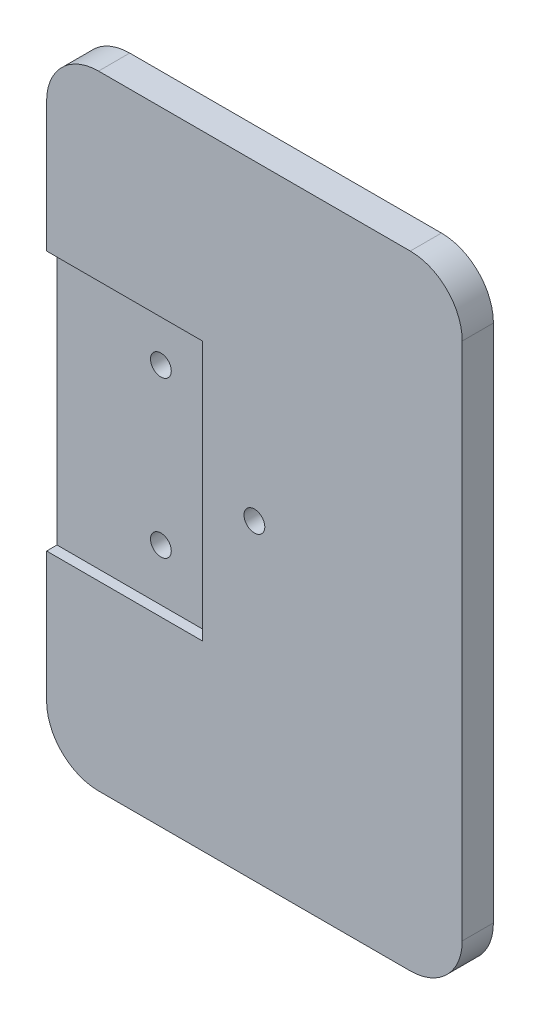
ISO-10303-21;
HEADER;
FILE_DESCRIPTION(('STEP AP214'),'2;1');
FILE_NAME('part.step','',(''),(''),'','','');
FILE_SCHEMA(('AUTOMOTIVE_DESIGN { 1 0 10303 214 1 1 1 1 }'));
ENDSEC;
DATA;
#1=APPLICATION_CONTEXT('core data for automotive mechanical design processes');
#2=APPLICATION_PROTOCOL_DEFINITION('international standard','automotive_design',2000,#1);
#3=PRODUCT_CONTEXT('',#1,'mechanical');
#4=PRODUCT('Part','Part','',(#3));
#5=PRODUCT_RELATED_PRODUCT_CATEGORY('part','',(#4));
#6=PRODUCT_DEFINITION_FORMATION('','',#4);
#7=PRODUCT_DEFINITION_CONTEXT('part definition',#1,'design');
#8=PRODUCT_DEFINITION('design','',#6,#7);
#9=PRODUCT_DEFINITION_SHAPE('','',#8);
#10=(LENGTH_UNIT() NAMED_UNIT(*) SI_UNIT(.MILLI.,.METRE.));
#11=(NAMED_UNIT(*) PLANE_ANGLE_UNIT() SI_UNIT($,.RADIAN.));
#12=(NAMED_UNIT(*) SI_UNIT($,.STERADIAN.) SOLID_ANGLE_UNIT());
#13=UNCERTAINTY_MEASURE_WITH_UNIT(LENGTH_MEASURE(1.E-05),#10,'distance_accuracy_value','');
#14=(GEOMETRIC_REPRESENTATION_CONTEXT(3) GLOBAL_UNCERTAINTY_ASSIGNED_CONTEXT((#13)) GLOBAL_UNIT_ASSIGNED_CONTEXT((#10,
#11,#12)) REPRESENTATION_CONTEXT('',''));
#15=CARTESIAN_POINT('',(0.,0.,0.));
#16=DIRECTION('',(0.,0.,1.));
#17=DIRECTION('',(1.,0.,0.));
#18=AXIS2_PLACEMENT_3D('',#15,#16,#17);
#19=CARTESIAN_POINT('',(-65.9850692997892,26.8064344030394,-3.));
#20=DIRECTION('',(0.,-1.,0.));
#21=DIRECTION('',(0.,0.,-1.));
#22=AXIS2_PLACEMENT_3D('',#19,#20,#21);
#23=PLANE('',#22);
#24=DIRECTION('',(1.,0.,0.));
#25=VECTOR('',#24,1.);
#26=CARTESIAN_POINT('',(-65.9850692997892,26.8064344030394,0.));
#27=LINE('',#26,#25);
#28=CARTESIAN_POINT('',(-60.9850692997892,26.8064344030394,0.));
#29=VERTEX_POINT('',#28);
#30=CARTESIAN_POINT('',(-30.9850692997892,26.8064344030394,0.));
#31=VERTEX_POINT('',#30);
#32=EDGE_CURVE('E190',#29,#31,#27,.T.);
#33=ORIENTED_EDGE('',*,*,#32,.T.);
#34=DIRECTION('',(0.,0.,1.));
#35=VECTOR('',#34,1.);
#36=CARTESIAN_POINT('',(-30.9850692997892,26.8064344030394,-3.));
#37=LINE('',#36,#35);
#38=CARTESIAN_POINT('',(-30.9850692997892,26.8064344030394,-3.));
#39=VERTEX_POINT('',#38);
#40=EDGE_CURVE('E250',#31,#39,#37,.F.);
#41=ORIENTED_EDGE('',*,*,#40,.T.);
#42=DIRECTION('',(1.,0.,0.));
#43=VECTOR('',#42,1.);
#44=CARTESIAN_POINT('',(-65.9850692997892,26.8064344030394,-3.));
#45=LINE('',#44,#43);
#46=CARTESIAN_POINT('',(-60.9850692997892,26.8064344030394,-3.));
#47=VERTEX_POINT('',#46);
#48=EDGE_CURVE('E197',#47,#39,#45,.T.);
#49=ORIENTED_EDGE('',*,*,#48,.F.);
#50=DIRECTION('',(0.,0.,1.));
#51=VECTOR('',#50,1.);
#52=CARTESIAN_POINT('',(-60.9850692997892,26.8064344030394,0.));
#53=LINE('',#52,#51);
#54=EDGE_CURVE('E246',#47,#29,#53,.T.);
#55=ORIENTED_EDGE('',*,*,#54,.T.);
#56=EDGE_LOOP('',(#33,#41,#49,#55));
#57=FACE_BOUND('',#56,.T.);
#58=ADVANCED_FACE('F49',(#57),#23,.F.);
#59=CARTESIAN_POINT('',(-25.9850692997892,26.8064344030394,-3.));
#60=DIRECTION('',(-1.,0.,0.));
#61=DIRECTION('',(0.,-1.,0.));
#62=AXIS2_PLACEMENT_3D('',#59,#60,#61);
#63=PLANE('',#62);
#64=DIRECTION('',(0.,-1.,0.));
#65=VECTOR('',#64,1.);
#66=CARTESIAN_POINT('',(-25.9850692997892,26.8064344030394,-3.));
#67=LINE('',#66,#65);
#68=CARTESIAN_POINT('',(-25.9850692997892,21.8064344030394,-3.));
#69=VERTEX_POINT('',#68);
#70=CARTESIAN_POINT('',(-25.9850692997892,-28.1935655969606,-3.));
#71=VERTEX_POINT('',#70);
#72=EDGE_CURVE('E201',#69,#71,#67,.T.);
#73=ORIENTED_EDGE('',*,*,#72,.F.);
#74=DIRECTION('',(0.,0.,1.));
#75=VECTOR('',#74,1.);
#76=CARTESIAN_POINT('',(-25.9850692997892,21.8064344030394,-3.));
#77=LINE('',#76,#75);
#78=CARTESIAN_POINT('',(-25.9850692997892,21.8064344030394,0.));
#79=VERTEX_POINT('',#78);
#80=EDGE_CURVE('E230',#69,#79,#77,.T.);
#81=ORIENTED_EDGE('',*,*,#80,.T.);
#82=DIRECTION('',(0.,-1.,0.));
#83=VECTOR('',#82,1.);
#84=CARTESIAN_POINT('',(-25.9850692997892,26.8064344030394,0.));
#85=LINE('',#84,#83);
#86=CARTESIAN_POINT('',(-25.9850692997892,-28.1935655969606,0.));
#87=VERTEX_POINT('',#86);
#88=EDGE_CURVE('E217',#79,#87,#85,.T.);
#89=ORIENTED_EDGE('',*,*,#88,.T.);
#90=DIRECTION('',(0.,0.,1.));
#91=VECTOR('',#90,1.);
#92=CARTESIAN_POINT('',(-25.9850692997892,-28.1935655969606,-3.));
#93=LINE('',#92,#91);
#94=EDGE_CURVE('E213',#87,#71,#93,.F.);
#95=ORIENTED_EDGE('',*,*,#94,.T.);
#96=EDGE_LOOP('',(#73,#81,#89,#95));
#97=FACE_BOUND('',#96,.T.);
#98=ADVANCED_FACE('F294',(#97),#63,.F.);
#99=CARTESIAN_POINT('',(-65.9850692997892,-33.1935655969606,-3.));
#100=DIRECTION('',(0.,-1.,0.));
#101=DIRECTION('',(0.,0.,-1.));
#102=AXIS2_PLACEMENT_3D('',#99,#100,#101);
#103=PLANE('',#102);
#104=DIRECTION('',(1.,0.,0.));
#105=VECTOR('',#104,1.);
#106=CARTESIAN_POINT('',(-65.9850692997892,-33.1935655969606,-3.));
#107=LINE('',#106,#105);
#108=CARTESIAN_POINT('',(-60.9850692997892,-33.1935655969606,-3.));
#109=VERTEX_POINT('',#108);
#110=CARTESIAN_POINT('',(-30.9850692997892,-33.1935655969606,-3.));
#111=VERTEX_POINT('',#110);
#112=EDGE_CURVE('E206',#109,#111,#107,.T.);
#113=ORIENTED_EDGE('',*,*,#112,.T.);
#114=DIRECTION('',(0.,0.,1.));
#115=VECTOR('',#114,1.);
#116=CARTESIAN_POINT('',(-30.9850692997892,-33.1935655969606,0.));
#117=LINE('',#116,#115);
#118=CARTESIAN_POINT('',(-30.9850692997892,-33.1935655969606,0.));
#119=VERTEX_POINT('',#118);
#120=EDGE_CURVE('E267',#111,#119,#117,.T.);
#121=ORIENTED_EDGE('',*,*,#120,.T.);
#122=DIRECTION('',(1.,0.,0.));
#123=VECTOR('',#122,1.);
#124=CARTESIAN_POINT('',(-65.9850692997892,-33.1935655969606,0.));
#125=LINE('',#124,#123);
#126=CARTESIAN_POINT('',(-60.9850692997892,-33.1935655969606,0.));
#127=VERTEX_POINT('',#126);
#128=EDGE_CURVE('E221',#127,#119,#125,.T.);
#129=ORIENTED_EDGE('',*,*,#128,.F.);
#130=DIRECTION('',(0.,0.,1.));
#131=VECTOR('',#130,1.);
#132=CARTESIAN_POINT('',(-60.9850692997892,-33.1935655969606,-3.));
#133=LINE('',#132,#131);
#134=EDGE_CURVE('E264',#127,#109,#133,.F.);
#135=ORIENTED_EDGE('',*,*,#134,.T.);
#136=EDGE_LOOP('',(#113,#121,#129,#135));
#137=FACE_BOUND('',#136,.T.);
#138=ADVANCED_FACE('F285',(#137),#103,.T.);
#139=CARTESIAN_POINT('',(-65.9850692997892,26.8064344030394,-3.));
#140=DIRECTION('',(-1.,0.,0.));
#141=DIRECTION('',(0.,-1.,0.));
#142=AXIS2_PLACEMENT_3D('',#139,#140,#141);
#143=PLANE('',#142);
#144=DIRECTION('',(0.,-1.,0.));
#145=VECTOR('',#144,1.);
#146=CARTESIAN_POINT('',(-65.9850692997892,26.8064344030394,-3.));
#147=LINE('',#146,#145);
#148=CARTESIAN_POINT('',(-65.9850692997892,21.8064344030394,-3.));
#149=VERTEX_POINT('',#148);
#150=CARTESIAN_POINT('',(-65.9850692997892,-28.1935655969606,-3.));
#151=VERTEX_POINT('',#150);
#152=EDGE_CURVE('E210',#149,#151,#147,.T.);
#153=ORIENTED_EDGE('',*,*,#152,.T.);
#154=DIRECTION('',(0.,0.,1.));
#155=VECTOR('',#154,1.);
#156=CARTESIAN_POINT('',(-65.9850692997892,-28.1935655969606,-3.));
#157=LINE('',#156,#155);
#158=CARTESIAN_POINT('',(-65.9850692997892,-28.1935655969606,0.));
#159=VERTEX_POINT('',#158);
#160=EDGE_CURVE('E11',#151,#159,#157,.T.);
#161=ORIENTED_EDGE('',*,*,#160,.T.);
#162=DIRECTION('',(0.,-1.,0.));
#163=VECTOR('',#162,1.);
#164=CARTESIAN_POINT('',(-65.9850692997892,26.8064344030394,0.));
#165=LINE('',#164,#163);
#166=CARTESIAN_POINT('',(-65.9850692997892,-15.6935655969606,0.));
#167=VERTEX_POINT('',#166);
#168=EDGE_CURVE('E225',#167,#159,#165,.T.);
#169=ORIENTED_EDGE('',*,*,#168,.F.);
#170=DIRECTION('',(0.,0.,1.));
#171=VECTOR('',#170,1.);
#172=CARTESIAN_POINT('',(-65.9850692997892,-15.6935655969606,-1.));
#173=LINE('',#172,#171);
#174=CARTESIAN_POINT('',(-65.9850692997892,-15.6935655969606,-1.));
#175=VERTEX_POINT('',#174);
#176=EDGE_CURVE('E187',#175,#167,#173,.T.);
#177=ORIENTED_EDGE('',*,*,#176,.F.);
#178=DIRECTION('',(0.,-1.,0.));
#179=VECTOR('',#178,1.);
#180=CARTESIAN_POINT('',(-65.9850692997892,9.30643440303937,-1.));
#181=LINE('',#180,#179);
#182=CARTESIAN_POINT('',(-65.9850692997892,9.30643440303937,-1.));
#183=VERTEX_POINT('',#182);
#184=EDGE_CURVE('E162',#183,#175,#181,.T.);
#185=ORIENTED_EDGE('',*,*,#184,.F.);
#186=DIRECTION('',(0.,0.,1.));
#187=VECTOR('',#186,1.);
#188=CARTESIAN_POINT('',(-65.9850692997892,9.30643440303937,-1.));
#189=LINE('',#188,#187);
#190=CARTESIAN_POINT('',(-65.9850692997892,9.30643440303937,0.));
#191=VERTEX_POINT('',#190);
#192=EDGE_CURVE('E191',#183,#191,#189,.T.);
#193=ORIENTED_EDGE('',*,*,#192,.T.);
#194=CARTESIAN_POINT('',(-65.9850692997892,21.8064344030394,0.));
#195=VERTEX_POINT('',#194);
#196=EDGE_CURVE('E202',#195,#191,#165,.T.);
#197=ORIENTED_EDGE('',*,*,#196,.F.);
#198=DIRECTION('',(0.,0.,1.));
#199=VECTOR('',#198,1.);
#200=CARTESIAN_POINT('',(-65.9850692997892,21.8064344030394,-3.));
#201=LINE('',#200,#199);
#202=EDGE_CURVE('E59',#195,#149,#201,.F.);
#203=ORIENTED_EDGE('',*,*,#202,.T.);
#204=EDGE_LOOP('',(#153,#161,#169,#177,#185,#193,#197,#203));
#205=FACE_BOUND('',#204,.T.);
#206=ADVANCED_FACE('F279',(#205),#143,.T.);
#207=CARTESIAN_POINT('',(0.,0.,-3.));
#208=DIRECTION('',(0.,0.,-1.));
#209=DIRECTION('',(-1.,0.,0.));
#210=AXIS2_PLACEMENT_3D('',#207,#208,#209);
#211=PLANE('',#210);
#212=CARTESIAN_POINT('',(-45.9850692997892,-3.19356559696063,-3.));
#213=DIRECTION('',(0.,0.,-1.));
#214=DIRECTION('',(-1.,0.,0.));
#215=AXIS2_PLACEMENT_3D('',#212,#213,#214);
#216=CIRCLE('',#215,0.999999999999998);
#217=CARTESIAN_POINT('',(-46.9850692997892,-3.19356559696063,-3.));
#218=VERTEX_POINT('',#217);
#219=EDGE_CURVE('E376',#218,#218,#216,.T.);
#220=ORIENTED_EDGE('',*,*,#219,.F.);
#221=EDGE_LOOP('',(#220));
#222=FACE_BOUND('',#221,.T.);
#223=CARTESIAN_POINT('',(-55.9850692997892,-10.6935655969606,-3.));
#224=DIRECTION('',(0.,0.,1.));
#225=DIRECTION('',(1.,0.,0.));
#226=AXIS2_PLACEMENT_3D('',#223,#224,#225);
#227=CIRCLE('',#226,0.999999999999998);
#228=CARTESIAN_POINT('',(-54.9850692997892,-10.6935655969606,-3.));
#229=VERTEX_POINT('',#228);
#230=EDGE_CURVE('E365',#229,#229,#227,.T.);
#231=ORIENTED_EDGE('',*,*,#230,.T.);
#232=EDGE_LOOP('',(#231));
#233=FACE_BOUND('',#232,.T.);
#234=CARTESIAN_POINT('',(-55.9850692997892,4.30643440303937,-3.));
#235=DIRECTION('',(0.,0.,1.));
#236=DIRECTION('',(1.,0.,0.));
#237=AXIS2_PLACEMENT_3D('',#234,#235,#236);
#238=CIRCLE('',#237,0.999999999999998);
#239=CARTESIAN_POINT('',(-54.9850692997892,4.30643440303937,-3.));
#240=VERTEX_POINT('',#239);
#241=EDGE_CURVE('E184',#240,#240,#238,.T.);
#242=ORIENTED_EDGE('',*,*,#241,.T.);
#243=EDGE_LOOP('',(#242));
#244=FACE_BOUND('',#243,.T.);
#245=ORIENTED_EDGE('',*,*,#48,.T.);
#246=CARTESIAN_POINT('',(-30.9850692997892,21.8064344030394,-3.));
#247=DIRECTION('',(0.,0.,-1.));
#248=DIRECTION('',(-1.,0.,0.));
#249=AXIS2_PLACEMENT_3D('',#246,#247,#248);
#250=CIRCLE('',#249,5.);
#251=EDGE_CURVE('E261',#39,#69,#250,.T.);
#252=ORIENTED_EDGE('',*,*,#251,.T.);
#253=ORIENTED_EDGE('',*,*,#72,.T.);
#254=CARTESIAN_POINT('',(-30.9850692997892,-28.1935655969606,-3.));
#255=DIRECTION('',(0.,0.,-1.));
#256=DIRECTION('',(-1.,0.,0.));
#257=AXIS2_PLACEMENT_3D('',#254,#255,#256);
#258=CIRCLE('',#257,5.);
#259=EDGE_CURVE('E258',#71,#111,#258,.T.);
#260=ORIENTED_EDGE('',*,*,#259,.T.);
#261=ORIENTED_EDGE('',*,*,#112,.F.);
#262=CARTESIAN_POINT('',(-60.9850692997892,-28.1935655969606,-3.));
#263=DIRECTION('',(0.,0.,-1.));
#264=DIRECTION('',(-1.,0.,0.));
#265=AXIS2_PLACEMENT_3D('',#262,#263,#264);
#266=CIRCLE('',#265,5.);
#267=EDGE_CURVE('E66',#109,#151,#266,.T.);
#268=ORIENTED_EDGE('',*,*,#267,.T.);
#269=ORIENTED_EDGE('',*,*,#152,.F.);
#270=CARTESIAN_POINT('',(-60.9850692997892,21.8064344030394,-3.));
#271=DIRECTION('',(0.,0.,-1.));
#272=DIRECTION('',(-1.,0.,0.));
#273=AXIS2_PLACEMENT_3D('',#270,#271,#272);
#274=CIRCLE('',#273,5.);
#275=EDGE_CURVE('E253',#149,#47,#274,.T.);
#276=ORIENTED_EDGE('',*,*,#275,.T.);
#277=EDGE_LOOP('',(#245,#252,#253,#260,#261,#268,#269,#276));
#278=FACE_BOUND('',#277,.T.);
#279=ADVANCED_FACE('F287',(#222,#233,#244,#278),#211,.T.);
#280=CARTESIAN_POINT('',(0.,0.,0.));
#281=DIRECTION('',(0.,0.,-1.));
#282=DIRECTION('',(-1.,0.,0.));
#283=AXIS2_PLACEMENT_3D('',#280,#281,#282);
#284=PLANE('',#283);
#285=CARTESIAN_POINT('',(-45.9850692997892,-3.19356559696063,0.));
#286=DIRECTION('',(0.,0.,-1.));
#287=DIRECTION('',(-1.,0.,0.));
#288=AXIS2_PLACEMENT_3D('',#285,#286,#287);
#289=CIRCLE('',#288,0.999999999999998);
#290=CARTESIAN_POINT('',(-46.9850692997892,-3.19356559696063,0.));
#291=VERTEX_POINT('',#290);
#292=EDGE_CURVE('E53',#291,#291,#289,.T.);
#293=ORIENTED_EDGE('',*,*,#292,.T.);
#294=EDGE_LOOP('',(#293));
#295=FACE_BOUND('',#294,.T.);
#296=ORIENTED_EDGE('',*,*,#88,.F.);
#297=CARTESIAN_POINT('',(-30.9850692997892,21.8064344030394,0.));
#298=DIRECTION('',(0.,0.,-1.));
#299=DIRECTION('',(-1.,0.,0.));
#300=AXIS2_PLACEMENT_3D('',#297,#298,#299);
#301=CIRCLE('',#300,5.);
#302=EDGE_CURVE('E243',#79,#31,#301,.F.);
#303=ORIENTED_EDGE('',*,*,#302,.T.);
#304=ORIENTED_EDGE('',*,*,#32,.F.);
#305=CARTESIAN_POINT('',(-60.9850692997892,21.8064344030394,0.));
#306=DIRECTION('',(0.,0.,-1.));
#307=DIRECTION('',(-1.,0.,0.));
#308=AXIS2_PLACEMENT_3D('',#305,#306,#307);
#309=CIRCLE('',#308,5.);
#310=EDGE_CURVE('E234',#29,#195,#309,.F.);
#311=ORIENTED_EDGE('',*,*,#310,.T.);
#312=ORIENTED_EDGE('',*,*,#196,.T.);
#313=DIRECTION('',(1.,0.,0.));
#314=VECTOR('',#313,1.);
#315=CARTESIAN_POINT('',(-65.9850692997892,9.30643440303937,0.));
#316=LINE('',#315,#314);
#317=CARTESIAN_POINT('',(-50.9850692997892,9.30643440303937,0.));
#318=VERTEX_POINT('',#317);
#319=EDGE_CURVE('E168',#191,#318,#316,.T.);
#320=ORIENTED_EDGE('',*,*,#319,.T.);
#321=DIRECTION('',(0.,-1.,0.));
#322=VECTOR('',#321,1.);
#323=CARTESIAN_POINT('',(-50.9850692997892,9.30643440303937,0.));
#324=LINE('',#323,#322);
#325=CARTESIAN_POINT('',(-50.9850692997892,-15.6935655969606,0.));
#326=VERTEX_POINT('',#325);
#327=EDGE_CURVE('E172',#318,#326,#324,.T.);
#328=ORIENTED_EDGE('',*,*,#327,.T.);
#329=DIRECTION('',(1.,0.,0.));
#330=VECTOR('',#329,1.);
#331=CARTESIAN_POINT('',(-65.9850692997892,-15.6935655969606,0.));
#332=LINE('',#331,#330);
#333=EDGE_CURVE('E160',#167,#326,#332,.T.);
#334=ORIENTED_EDGE('',*,*,#333,.F.);
#335=ORIENTED_EDGE('',*,*,#168,.T.);
#336=CARTESIAN_POINT('',(-60.9850692997892,-28.1935655969606,0.));
#337=DIRECTION('',(0.,0.,-1.));
#338=DIRECTION('',(-1.,0.,0.));
#339=AXIS2_PLACEMENT_3D('',#336,#337,#338);
#340=CIRCLE('',#339,5.);
#341=EDGE_CURVE('E237',#159,#127,#340,.F.);
#342=ORIENTED_EDGE('',*,*,#341,.T.);
#343=ORIENTED_EDGE('',*,*,#128,.T.);
#344=CARTESIAN_POINT('',(-30.9850692997892,-28.1935655969606,0.));
#345=DIRECTION('',(0.,0.,-1.));
#346=DIRECTION('',(-1.,0.,0.));
#347=AXIS2_PLACEMENT_3D('',#344,#345,#346);
#348=CIRCLE('',#347,5.);
#349=EDGE_CURVE('E240',#119,#87,#348,.F.);
#350=ORIENTED_EDGE('',*,*,#349,.T.);
#351=EDGE_LOOP('',(#296,#303,#304,#311,#312,#320,#328,#334,#335,#342,#343,#350));
#352=FACE_BOUND('',#351,.T.);
#353=ADVANCED_FACE('F277',(#295,#352),#284,.F.);
#354=CARTESIAN_POINT('',(-65.9850692997892,-15.6935655969606,-1.));
#355=DIRECTION('',(0.,-1.,0.));
#356=DIRECTION('',(0.,0.,-1.));
#357=AXIS2_PLACEMENT_3D('',#354,#355,#356);
#358=PLANE('',#357);
#359=ORIENTED_EDGE('',*,*,#333,.T.);
#360=DIRECTION('',(0.,0.,1.));
#361=VECTOR('',#360,1.);
#362=CARTESIAN_POINT('',(-50.9850692997892,-15.6935655969606,-1.));
#363=LINE('',#362,#361);
#364=CARTESIAN_POINT('',(-50.9850692997892,-15.6935655969606,-1.));
#365=VERTEX_POINT('',#364);
#366=EDGE_CURVE('E146',#365,#326,#363,.T.);
#367=ORIENTED_EDGE('',*,*,#366,.F.);
#368=DIRECTION('',(1.,0.,0.));
#369=VECTOR('',#368,1.);
#370=CARTESIAN_POINT('',(-65.9850692997892,-15.6935655969606,-1.));
#371=LINE('',#370,#369);
#372=EDGE_CURVE('E154',#175,#365,#371,.T.);
#373=ORIENTED_EDGE('',*,*,#372,.F.);
#374=ORIENTED_EDGE('',*,*,#176,.T.);
#375=EDGE_LOOP('',(#359,#367,#373,#374));
#376=FACE_BOUND('',#375,.T.);
#377=ADVANCED_FACE('F157',(#376),#358,.F.);
#378=CARTESIAN_POINT('',(-65.9850692997892,9.30643440303937,-1.));
#379=DIRECTION('',(0.,-1.,0.));
#380=DIRECTION('',(0.,0.,-1.));
#381=AXIS2_PLACEMENT_3D('',#378,#379,#380);
#382=PLANE('',#381);
#383=ORIENTED_EDGE('',*,*,#319,.F.);
#384=ORIENTED_EDGE('',*,*,#192,.F.);
#385=DIRECTION('',(1.,0.,0.));
#386=VECTOR('',#385,1.);
#387=CARTESIAN_POINT('',(-65.9850692997892,9.30643440303937,-1.));
#388=LINE('',#387,#386);
#389=CARTESIAN_POINT('',(-50.9850692997892,9.30643440303937,-1.));
#390=VERTEX_POINT('',#389);
#391=EDGE_CURVE('E153',#183,#390,#388,.T.);
#392=ORIENTED_EDGE('',*,*,#391,.T.);
#393=DIRECTION('',(0.,0.,1.));
#394=VECTOR('',#393,1.);
#395=CARTESIAN_POINT('',(-50.9850692997892,9.30643440303937,-1.));
#396=LINE('',#395,#394);
#397=EDGE_CURVE('E148',#390,#318,#396,.T.);
#398=ORIENTED_EDGE('',*,*,#397,.T.);
#399=EDGE_LOOP('',(#383,#384,#392,#398));
#400=FACE_BOUND('',#399,.T.);
#401=ADVANCED_FACE('F308',(#400),#382,.T.);
#402=CARTESIAN_POINT('',(-50.9850692997892,9.30643440303937,-1.));
#403=DIRECTION('',(-1.,0.,0.));
#404=DIRECTION('',(0.,0.,1.));
#405=AXIS2_PLACEMENT_3D('',#402,#403,#404);
#406=PLANE('',#405);
#407=ORIENTED_EDGE('',*,*,#327,.F.);
#408=ORIENTED_EDGE('',*,*,#397,.F.);
#409=DIRECTION('',(0.,-1.,0.));
#410=VECTOR('',#409,1.);
#411=CARTESIAN_POINT('',(-50.9850692997892,9.30643440303937,-1.));
#412=LINE('',#411,#410);
#413=EDGE_CURVE('E142',#390,#365,#412,.T.);
#414=ORIENTED_EDGE('',*,*,#413,.T.);
#415=ORIENTED_EDGE('',*,*,#366,.T.);
#416=EDGE_LOOP('',(#407,#408,#414,#415));
#417=FACE_BOUND('',#416,.T.);
#418=ADVANCED_FACE('F145',(#417),#406,.T.);
#419=CARTESIAN_POINT('',(0.,0.,-1.));
#420=DIRECTION('',(0.,0.,-1.));
#421=DIRECTION('',(-1.,0.,0.));
#422=AXIS2_PLACEMENT_3D('',#419,#420,#421);
#423=PLANE('',#422);
#424=CARTESIAN_POINT('',(-55.9850692997892,-10.6935655969606,-1.));
#425=DIRECTION('',(0.,0.,1.));
#426=DIRECTION('',(1.,0.,0.));
#427=AXIS2_PLACEMENT_3D('',#424,#425,#426);
#428=CIRCLE('',#427,0.999999999999998);
#429=CARTESIAN_POINT('',(-54.9850692997892,-10.6935655969606,-1.));
#430=VERTEX_POINT('',#429);
#431=EDGE_CURVE('E360',#430,#430,#428,.T.);
#432=ORIENTED_EDGE('',*,*,#431,.F.);
#433=EDGE_LOOP('',(#432));
#434=FACE_BOUND('',#433,.T.);
#435=CARTESIAN_POINT('',(-55.9850692997892,4.30643440303937,-1.));
#436=DIRECTION('',(0.,0.,1.));
#437=DIRECTION('',(1.,0.,0.));
#438=AXIS2_PLACEMENT_3D('',#435,#436,#437);
#439=CIRCLE('',#438,0.999999999999998);
#440=CARTESIAN_POINT('',(-54.9850692997892,4.30643440303937,-1.));
#441=VERTEX_POINT('',#440);
#442=EDGE_CURVE('E175',#441,#441,#439,.T.);
#443=ORIENTED_EDGE('',*,*,#442,.F.);
#444=EDGE_LOOP('',(#443));
#445=FACE_BOUND('',#444,.T.);
#446=ORIENTED_EDGE('',*,*,#372,.T.);
#447=ORIENTED_EDGE('',*,*,#413,.F.);
#448=ORIENTED_EDGE('',*,*,#391,.F.);
#449=ORIENTED_EDGE('',*,*,#184,.T.);
#450=EDGE_LOOP('',(#446,#447,#448,#449));
#451=FACE_BOUND('',#450,.T.);
#452=ADVANCED_FACE('F164',(#434,#445,#451),#423,.F.);
#453=CARTESIAN_POINT('',(-55.9850692997892,4.30643440303937,-3.));
#454=DIRECTION('',(0.,0.,1.));
#455=DIRECTION('',(1.,0.,0.));
#456=AXIS2_PLACEMENT_3D('',#453,#454,#455);
#457=CYLINDRICAL_SURFACE('',#456,0.999999999999998);
#458=ORIENTED_EDGE('',*,*,#241,.F.);
#459=EDGE_LOOP('',(#458));
#460=FACE_BOUND('',#459,.T.);
#461=ORIENTED_EDGE('',*,*,#442,.T.);
#462=EDGE_LOOP('',(#461));
#463=FACE_BOUND('',#462,.T.);
#464=ADVANCED_FACE('F349',(#460,#463),#457,.F.);
#465=CARTESIAN_POINT('',(-55.9850692997892,-10.6935655969606,-3.));
#466=DIRECTION('',(0.,0.,1.));
#467=DIRECTION('',(1.,0.,0.));
#468=AXIS2_PLACEMENT_3D('',#465,#466,#467);
#469=CYLINDRICAL_SURFACE('',#468,0.999999999999998);
#470=ORIENTED_EDGE('',*,*,#230,.F.);
#471=EDGE_LOOP('',(#470));
#472=FACE_BOUND('',#471,.T.);
#473=ORIENTED_EDGE('',*,*,#431,.T.);
#474=EDGE_LOOP('',(#473));
#475=FACE_BOUND('',#474,.T.);
#476=ADVANCED_FACE('F329',(#472,#475),#469,.F.);
#477=CARTESIAN_POINT('',(-30.9850692997892,21.8064344030394,-3.));
#478=DIRECTION('',(0.,0.,1.));
#479=DIRECTION('',(1.,0.,0.));
#480=AXIS2_PLACEMENT_3D('',#477,#478,#479);
#481=CYLINDRICAL_SURFACE('',#480,5.);
#482=ORIENTED_EDGE('',*,*,#251,.F.);
#483=ORIENTED_EDGE('',*,*,#40,.F.);
#484=ORIENTED_EDGE('',*,*,#302,.F.);
#485=ORIENTED_EDGE('',*,*,#80,.F.);
#486=EDGE_LOOP('',(#482,#483,#484,#485));
#487=FACE_BOUND('',#486,.T.);
#488=ADVANCED_FACE('F298',(#487),#481,.T.);
#489=CARTESIAN_POINT('',(-30.9850692997892,-28.1935655969606,-3.));
#490=DIRECTION('',(0.,0.,-1.));
#491=DIRECTION('',(-1.,0.,0.));
#492=AXIS2_PLACEMENT_3D('',#489,#490,#491);
#493=CYLINDRICAL_SURFACE('',#492,5.);
#494=ORIENTED_EDGE('',*,*,#259,.F.);
#495=ORIENTED_EDGE('',*,*,#94,.F.);
#496=ORIENTED_EDGE('',*,*,#349,.F.);
#497=ORIENTED_EDGE('',*,*,#120,.F.);
#498=EDGE_LOOP('',(#494,#495,#496,#497));
#499=FACE_BOUND('',#498,.T.);
#500=ADVANCED_FACE('F292',(#499),#493,.T.);
#501=CARTESIAN_POINT('',(-60.9850692997892,-28.1935655969606,-3.));
#502=DIRECTION('',(0.,0.,1.));
#503=DIRECTION('',(1.,0.,0.));
#504=AXIS2_PLACEMENT_3D('',#501,#502,#503);
#505=CYLINDRICAL_SURFACE('',#504,5.);
#506=ORIENTED_EDGE('',*,*,#267,.F.);
#507=ORIENTED_EDGE('',*,*,#134,.F.);
#508=ORIENTED_EDGE('',*,*,#341,.F.);
#509=ORIENTED_EDGE('',*,*,#160,.F.);
#510=EDGE_LOOP('',(#506,#507,#508,#509));
#511=FACE_BOUND('',#510,.T.);
#512=ADVANCED_FACE('F282',(#511),#505,.T.);
#513=CARTESIAN_POINT('',(-60.9850692997892,21.8064344030394,-3.));
#514=DIRECTION('',(0.,0.,-1.));
#515=DIRECTION('',(-1.,0.,0.));
#516=AXIS2_PLACEMENT_3D('',#513,#514,#515);
#517=CYLINDRICAL_SURFACE('',#516,5.);
#518=ORIENTED_EDGE('',*,*,#275,.F.);
#519=ORIENTED_EDGE('',*,*,#202,.F.);
#520=ORIENTED_EDGE('',*,*,#310,.F.);
#521=ORIENTED_EDGE('',*,*,#54,.F.);
#522=EDGE_LOOP('',(#518,#519,#520,#521));
#523=FACE_BOUND('',#522,.T.);
#524=ADVANCED_FACE('F51',(#523),#517,.T.);
#525=CARTESIAN_POINT('',(-45.9850692997892,-3.19356559696063,9.00000000000001));
#526=DIRECTION('',(0.,0.,-1.));
#527=DIRECTION('',(-1.,0.,0.));
#528=AXIS2_PLACEMENT_3D('',#525,#526,#527);
#529=CYLINDRICAL_SURFACE('',#528,0.999999999999998);
#530=ORIENTED_EDGE('',*,*,#219,.T.);
#531=EDGE_LOOP('',(#530));
#532=FACE_BOUND('',#531,.T.);
#533=ORIENTED_EDGE('',*,*,#292,.F.);
#534=EDGE_LOOP('',(#533));
#535=FACE_BOUND('',#534,.T.);
#536=ADVANCED_FACE('F335',(#532,#535),#529,.F.);
#537=CLOSED_SHELL('',(#58,#98,#138,#206,#279,#353,#377,#401,#418,#452,#464,#476,#488,#500,#512,
#524,#536));
#538=MANIFOLD_SOLID_BREP('B2',#537);
#539=ADVANCED_BREP_SHAPE_REPRESENTATION('',(#18,#538),#14);
#540=SHAPE_DEFINITION_REPRESENTATION(#9,#539);
ENDSEC;
END-ISO-10303-21;
